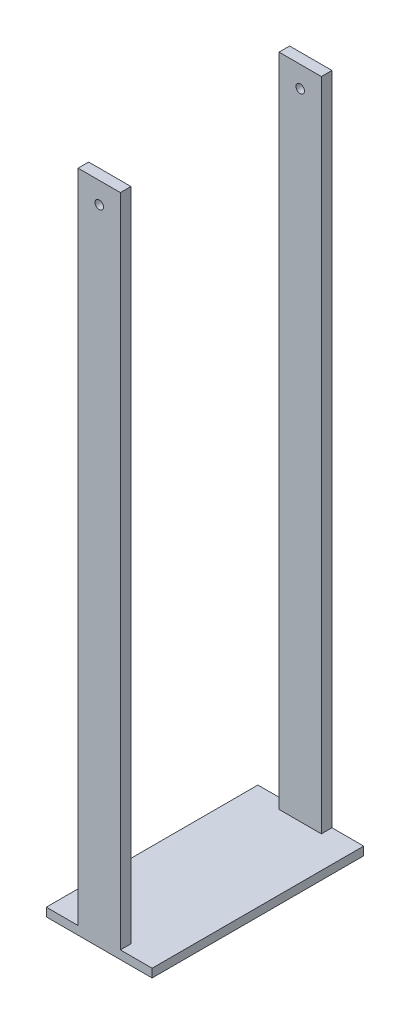
ISO-10303-21;
HEADER;
FILE_DESCRIPTION(('STEP AP214'),'2;1');
FILE_NAME('part.step','',(''),(''),'','','');
FILE_SCHEMA(('AUTOMOTIVE_DESIGN { 1 0 10303 214 1 1 1 1 }'));
ENDSEC;
DATA;
#1=APPLICATION_CONTEXT('core data for automotive mechanical design processes');
#2=APPLICATION_PROTOCOL_DEFINITION('international standard','automotive_design',2000,#1);
#3=PRODUCT_CONTEXT('',#1,'mechanical');
#4=PRODUCT('Part','Part','',(#3));
#5=PRODUCT_RELATED_PRODUCT_CATEGORY('part','',(#4));
#6=PRODUCT_DEFINITION_FORMATION('','',#4);
#7=PRODUCT_DEFINITION_CONTEXT('part definition',#1,'design');
#8=PRODUCT_DEFINITION('design','',#6,#7);
#9=PRODUCT_DEFINITION_SHAPE('','',#8);
#10=(LENGTH_UNIT() NAMED_UNIT(*) SI_UNIT(.MILLI.,.METRE.));
#11=(NAMED_UNIT(*) PLANE_ANGLE_UNIT() SI_UNIT($,.RADIAN.));
#12=(NAMED_UNIT(*) SI_UNIT($,.STERADIAN.) SOLID_ANGLE_UNIT());
#13=UNCERTAINTY_MEASURE_WITH_UNIT(LENGTH_MEASURE(1.E-05),#10,'distance_accuracy_value','');
#14=(GEOMETRIC_REPRESENTATION_CONTEXT(3) GLOBAL_UNCERTAINTY_ASSIGNED_CONTEXT((#13)) GLOBAL_UNIT_ASSIGNED_CONTEXT((#10,
#11,#12)) REPRESENTATION_CONTEXT('',''));
#15=CARTESIAN_POINT('',(0.,0.,0.));
#16=DIRECTION('',(0.,0.,1.));
#17=DIRECTION('',(1.,0.,0.));
#18=AXIS2_PLACEMENT_3D('',#15,#16,#17);
#19=CARTESIAN_POINT('',(57.3767857142857,-65.4360491071428,200.));
#20=DIRECTION('',(0.,-1.,0.));
#21=DIRECTION('',(0.,0.,-1.));
#22=AXIS2_PLACEMENT_3D('',#19,#20,#21);
#23=PLANE('',#22);
#24=DIRECTION('',(0.,0.,-1.));
#25=VECTOR('',#24,1.);
#26=CARTESIAN_POINT('',(27.3767857142857,-65.4360491071428,10.));
#27=LINE('',#26,#25);
#28=CARTESIAN_POINT('',(27.3767857142857,-65.4360491071428,10.));
#29=VERTEX_POINT('',#28);
#30=CARTESIAN_POINT('',(27.3767857142857,-65.4360491071428,0.));
#31=VERTEX_POINT('',#30);
#32=EDGE_CURVE('E48',#29,#31,#27,.T.);
#33=ORIENTED_EDGE('',*,*,#32,.F.);
#34=DIRECTION('',(1.,0.,0.));
#35=VECTOR('',#34,1.);
#36=CARTESIAN_POINT('',(27.3767857142857,-65.4360491071428,10.));
#37=LINE('',#36,#35);
#38=CARTESIAN_POINT('',(-12.6232142857143,-65.4360491071428,10.));
#39=VERTEX_POINT('',#38);
#40=EDGE_CURVE('E52',#39,#29,#37,.T.);
#41=ORIENTED_EDGE('',*,*,#40,.F.);
#42=DIRECTION('',(0.,0.,1.));
#43=VECTOR('',#42,1.);
#44=CARTESIAN_POINT('',(-12.6232142857143,-65.4360491071428,0.));
#45=LINE('',#44,#43);
#46=CARTESIAN_POINT('',(-12.6232142857143,-65.4360491071428,0.));
#47=VERTEX_POINT('',#46);
#48=EDGE_CURVE('E235',#47,#39,#45,.T.);
#49=ORIENTED_EDGE('',*,*,#48,.F.);
#50=DIRECTION('',(-1.,0.,0.));
#51=VECTOR('',#50,1.);
#52=CARTESIAN_POINT('',(57.3767857142857,-65.4360491071428,0.));
#53=LINE('',#52,#51);
#54=CARTESIAN_POINT('',(-42.6232142857143,-65.4360491071428,0.));
#55=VERTEX_POINT('',#54);
#56=EDGE_CURVE('E221',#47,#55,#53,.T.);
#57=ORIENTED_EDGE('',*,*,#56,.T.);
#58=DIRECTION('',(0.,0.,-1.));
#59=VECTOR('',#58,1.);
#60=CARTESIAN_POINT('',(-42.6232142857143,-65.4360491071428,200.));
#61=LINE('',#60,#59);
#62=CARTESIAN_POINT('',(-42.6232142857143,-65.4360491071428,200.));
#63=VERTEX_POINT('',#62);
#64=EDGE_CURVE('E211',#63,#55,#61,.T.);
#65=ORIENTED_EDGE('',*,*,#64,.F.);
#66=DIRECTION('',(-1.,0.,0.));
#67=VECTOR('',#66,1.);
#68=CARTESIAN_POINT('',(57.3767857142857,-65.4360491071428,200.));
#69=LINE('',#68,#67);
#70=CARTESIAN_POINT('',(-12.6232142857143,-65.4360491071428,200.));
#71=VERTEX_POINT('',#70);
#72=EDGE_CURVE('E202',#71,#63,#69,.T.);
#73=ORIENTED_EDGE('',*,*,#72,.F.);
#74=DIRECTION('',(0.,0.,1.));
#75=VECTOR('',#74,1.);
#76=CARTESIAN_POINT('',(-12.6232142857143,-65.4360491071428,190.));
#77=LINE('',#76,#75);
#78=CARTESIAN_POINT('',(-12.6232142857143,-65.4360491071428,190.));
#79=VERTEX_POINT('',#78);
#80=EDGE_CURVE('E157',#79,#71,#77,.T.);
#81=ORIENTED_EDGE('',*,*,#80,.F.);
#82=DIRECTION('',(-1.,0.,0.));
#83=VECTOR('',#82,1.);
#84=CARTESIAN_POINT('',(-12.6232142857143,-65.4360491071428,190.));
#85=LINE('',#84,#83);
#86=CARTESIAN_POINT('',(27.3767857142857,-65.4360491071428,190.));
#87=VERTEX_POINT('',#86);
#88=EDGE_CURVE('E147',#87,#79,#85,.T.);
#89=ORIENTED_EDGE('',*,*,#88,.F.);
#90=DIRECTION('',(0.,0.,-1.));
#91=VECTOR('',#90,1.);
#92=CARTESIAN_POINT('',(27.3767857142857,-65.4360491071428,200.));
#93=LINE('',#92,#91);
#94=CARTESIAN_POINT('',(27.3767857142857,-65.4360491071428,200.));
#95=VERTEX_POINT('',#94);
#96=EDGE_CURVE('E144',#95,#87,#93,.T.);
#97=ORIENTED_EDGE('',*,*,#96,.F.);
#98=CARTESIAN_POINT('',(57.3767857142857,-65.4360491071428,200.));
#99=VERTEX_POINT('',#98);
#100=EDGE_CURVE('E209',#99,#95,#69,.T.);
#101=ORIENTED_EDGE('',*,*,#100,.F.);
#102=DIRECTION('',(0.,0.,-1.));
#103=VECTOR('',#102,1.);
#104=CARTESIAN_POINT('',(57.3767857142857,-65.4360491071428,200.));
#105=LINE('',#104,#103);
#106=CARTESIAN_POINT('',(57.3767857142857,-65.4360491071428,0.));
#107=VERTEX_POINT('',#106);
#108=EDGE_CURVE('E215',#99,#107,#105,.T.);
#109=ORIENTED_EDGE('',*,*,#108,.T.);
#110=EDGE_CURVE('E198',#107,#31,#53,.T.);
#111=ORIENTED_EDGE('',*,*,#110,.T.);
#112=EDGE_LOOP('',(#33,#41,#49,#57,#65,#73,#81,#89,#97,#101,#109,#111));
#113=FACE_BOUND('',#112,.T.);
#114=ADVANCED_FACE('F31',(#113),#23,.F.);
#115=CARTESIAN_POINT('',(-42.6232142857143,-65.4360491071428,200.));
#116=DIRECTION('',(1.,0.,0.));
#117=DIRECTION('',(0.,1.,0.));
#118=AXIS2_PLACEMENT_3D('',#115,#116,#117);
#119=PLANE('',#118);
#120=DIRECTION('',(0.,-1.,0.));
#121=VECTOR('',#120,1.);
#122=CARTESIAN_POINT('',(-42.6232142857143,-65.4360491071428,0.));
#123=LINE('',#122,#121);
#124=CARTESIAN_POINT('',(-42.6232142857143,-73.4360491071428,0.));
#125=VERTEX_POINT('',#124);
#126=EDGE_CURVE('E192',#55,#125,#123,.T.);
#127=ORIENTED_EDGE('',*,*,#126,.T.);
#128=DIRECTION('',(0.,0.,-1.));
#129=VECTOR('',#128,1.);
#130=CARTESIAN_POINT('',(-42.6232142857143,-73.4360491071428,200.));
#131=LINE('',#130,#129);
#132=CARTESIAN_POINT('',(-42.6232142857143,-73.4360491071428,200.));
#133=VERTEX_POINT('',#132);
#134=EDGE_CURVE('E11',#133,#125,#131,.T.);
#135=ORIENTED_EDGE('',*,*,#134,.F.);
#136=DIRECTION('',(0.,-1.,0.));
#137=VECTOR('',#136,1.);
#138=CARTESIAN_POINT('',(-42.6232142857143,-65.4360491071428,200.));
#139=LINE('',#138,#137);
#140=EDGE_CURVE('E194',#63,#133,#139,.T.);
#141=ORIENTED_EDGE('',*,*,#140,.F.);
#142=ORIENTED_EDGE('',*,*,#64,.T.);
#143=EDGE_LOOP('',(#127,#135,#141,#142));
#144=FACE_BOUND('',#143,.T.);
#145=ADVANCED_FACE('F33',(#144),#119,.F.);
#146=CARTESIAN_POINT('',(-42.6232142857143,-73.4360491071428,200.));
#147=DIRECTION('',(0.,1.,0.));
#148=DIRECTION('',(0.,0.,1.));
#149=AXIS2_PLACEMENT_3D('',#146,#147,#148);
#150=PLANE('',#149);
#151=DIRECTION('',(1.,0.,0.));
#152=VECTOR('',#151,1.);
#153=CARTESIAN_POINT('',(-42.6232142857143,-73.4360491071428,0.));
#154=LINE('',#153,#152);
#155=CARTESIAN_POINT('',(57.3767857142857,-73.4360491071428,0.));
#156=VERTEX_POINT('',#155);
#157=EDGE_CURVE('E223',#125,#156,#154,.T.);
#158=ORIENTED_EDGE('',*,*,#157,.T.);
#159=DIRECTION('',(0.,0.,-1.));
#160=VECTOR('',#159,1.);
#161=CARTESIAN_POINT('',(57.3767857142857,-73.4360491071428,200.));
#162=LINE('',#161,#160);
#163=CARTESIAN_POINT('',(57.3767857142857,-73.4360491071428,200.));
#164=VERTEX_POINT('',#163);
#165=EDGE_CURVE('E40',#164,#156,#162,.T.);
#166=ORIENTED_EDGE('',*,*,#165,.F.);
#167=DIRECTION('',(1.,0.,0.));
#168=VECTOR('',#167,1.);
#169=CARTESIAN_POINT('',(-42.6232142857143,-73.4360491071428,200.));
#170=LINE('',#169,#168);
#171=EDGE_CURVE('E197',#133,#164,#170,.T.);
#172=ORIENTED_EDGE('',*,*,#171,.F.);
#173=ORIENTED_EDGE('',*,*,#134,.T.);
#174=EDGE_LOOP('',(#158,#166,#172,#173));
#175=FACE_BOUND('',#174,.T.);
#176=ADVANCED_FACE('F232',(#175),#150,.F.);
#177=CARTESIAN_POINT('',(57.3767857142857,-65.4360491071428,200.));
#178=DIRECTION('',(-1.,0.,0.));
#179=DIRECTION('',(0.,0.,1.));
#180=AXIS2_PLACEMENT_3D('',#177,#178,#179);
#181=PLANE('',#180);
#182=DIRECTION('',(0.,1.,0.));
#183=VECTOR('',#182,1.);
#184=CARTESIAN_POINT('',(57.3767857142857,-65.4360491071428,0.));
#185=LINE('',#184,#183);
#186=EDGE_CURVE('E222',#156,#107,#185,.T.);
#187=ORIENTED_EDGE('',*,*,#186,.T.);
#188=ORIENTED_EDGE('',*,*,#108,.F.);
#189=DIRECTION('',(0.,1.,0.));
#190=VECTOR('',#189,1.);
#191=CARTESIAN_POINT('',(57.3767857142857,-65.4360491071428,200.));
#192=LINE('',#191,#190);
#193=EDGE_CURVE('E200',#164,#99,#192,.T.);
#194=ORIENTED_EDGE('',*,*,#193,.F.);
#195=ORIENTED_EDGE('',*,*,#165,.T.);
#196=EDGE_LOOP('',(#187,#188,#194,#195));
#197=FACE_BOUND('',#196,.T.);
#198=ADVANCED_FACE('F269',(#197),#181,.F.);
#199=CARTESIAN_POINT('',(-42.6232142857143,-73.4360491071428,200.));
#200=DIRECTION('',(0.,0.,1.));
#201=DIRECTION('',(1.,0.,0.));
#202=AXIS2_PLACEMENT_3D('',#199,#200,#201);
#203=PLANE('',#202);
#204=CARTESIAN_POINT('',(7.37678571428573,534.563950892857,200.));
#205=DIRECTION('',(0.,0.,1.));
#206=DIRECTION('',(1.,0.,0.));
#207=AXIS2_PLACEMENT_3D('',#204,#205,#206);
#208=CIRCLE('',#207,4.);
#209=CARTESIAN_POINT('',(11.3767857142857,534.563950892857,200.));
#210=VERTEX_POINT('',#209);
#211=EDGE_CURVE('E366',#210,#210,#208,.T.);
#212=ORIENTED_EDGE('',*,*,#211,.F.);
#213=EDGE_LOOP('',(#212));
#214=FACE_BOUND('',#213,.T.);
#215=ORIENTED_EDGE('',*,*,#140,.T.);
#216=ORIENTED_EDGE('',*,*,#171,.T.);
#217=ORIENTED_EDGE('',*,*,#193,.T.);
#218=ORIENTED_EDGE('',*,*,#100,.T.);
#219=DIRECTION('',(0.,-1.,0.));
#220=VECTOR('',#219,1.);
#221=CARTESIAN_POINT('',(27.3767857142857,554.563950892857,200.));
#222=LINE('',#221,#220);
#223=CARTESIAN_POINT('',(27.3767857142857,554.563950892857,200.));
#224=VERTEX_POINT('',#223);
#225=EDGE_CURVE('E187',#224,#95,#222,.T.);
#226=ORIENTED_EDGE('',*,*,#225,.F.);
#227=DIRECTION('',(1.,0.,0.));
#228=VECTOR('',#227,1.);
#229=CARTESIAN_POINT('',(-12.6232142857143,554.563950892857,200.));
#230=LINE('',#229,#228);
#231=CARTESIAN_POINT('',(-12.6232142857143,554.563950892857,200.));
#232=VERTEX_POINT('',#231);
#233=EDGE_CURVE('E153',#232,#224,#230,.T.);
#234=ORIENTED_EDGE('',*,*,#233,.F.);
#235=DIRECTION('',(0.,-1.,0.));
#236=VECTOR('',#235,1.);
#237=CARTESIAN_POINT('',(-12.6232142857143,554.563950892857,200.));
#238=LINE('',#237,#236);
#239=EDGE_CURVE('E163',#232,#71,#238,.T.);
#240=ORIENTED_EDGE('',*,*,#239,.T.);
#241=ORIENTED_EDGE('',*,*,#72,.T.);
#242=EDGE_LOOP('',(#215,#216,#217,#218,#226,#234,#240,#241));
#243=FACE_BOUND('',#242,.T.);
#244=ADVANCED_FACE('F234',(#214,#243),#203,.T.);
#245=CARTESIAN_POINT('',(-42.6232142857143,-73.4360491071428,0.));
#246=DIRECTION('',(0.,0.,1.));
#247=DIRECTION('',(1.,0.,0.));
#248=AXIS2_PLACEMENT_3D('',#245,#246,#247);
#249=PLANE('',#248);
#250=CARTESIAN_POINT('',(7.37678571428573,534.563950892857,0.));
#251=DIRECTION('',(0.,0.,1.));
#252=DIRECTION('',(1.,0.,0.));
#253=AXIS2_PLACEMENT_3D('',#250,#251,#252);
#254=CIRCLE('',#253,4.);
#255=CARTESIAN_POINT('',(11.3767857142857,534.563950892857,0.));
#256=VERTEX_POINT('',#255);
#257=EDGE_CURVE('E245',#256,#256,#254,.T.);
#258=ORIENTED_EDGE('',*,*,#257,.T.);
#259=EDGE_LOOP('',(#258));
#260=FACE_BOUND('',#259,.T.);
#261=ORIENTED_EDGE('',*,*,#126,.F.);
#262=ORIENTED_EDGE('',*,*,#56,.F.);
#263=DIRECTION('',(0.,-1.,0.));
#264=VECTOR('',#263,1.);
#265=CARTESIAN_POINT('',(-12.6232142857143,554.563950892857,0.));
#266=LINE('',#265,#264);
#267=CARTESIAN_POINT('',(-12.6232142857143,554.563950892857,0.));
#268=VERTEX_POINT('',#267);
#269=EDGE_CURVE('E129',#268,#47,#266,.T.);
#270=ORIENTED_EDGE('',*,*,#269,.F.);
#271=DIRECTION('',(-1.,0.,0.));
#272=VECTOR('',#271,1.);
#273=CARTESIAN_POINT('',(27.3767857142857,554.563950892857,0.));
#274=LINE('',#273,#272);
#275=CARTESIAN_POINT('',(27.3767857142857,554.563950892857,0.));
#276=VERTEX_POINT('',#275);
#277=EDGE_CURVE('E121',#276,#268,#274,.T.);
#278=ORIENTED_EDGE('',*,*,#277,.F.);
#279=DIRECTION('',(0.,-1.,0.));
#280=VECTOR('',#279,1.);
#281=CARTESIAN_POINT('',(27.3767857142857,554.563950892857,0.));
#282=LINE('',#281,#280);
#283=EDGE_CURVE('E127',#276,#31,#282,.T.);
#284=ORIENTED_EDGE('',*,*,#283,.T.);
#285=ORIENTED_EDGE('',*,*,#110,.F.);
#286=ORIENTED_EDGE('',*,*,#186,.F.);
#287=ORIENTED_EDGE('',*,*,#157,.F.);
#288=EDGE_LOOP('',(#261,#262,#270,#278,#284,#285,#286,#287));
#289=FACE_BOUND('',#288,.T.);
#290=ADVANCED_FACE('F124',(#260,#289),#249,.F.);
#291=CARTESIAN_POINT('',(27.3767857142857,554.563950892857,200.));
#292=DIRECTION('',(-1.,0.,0.));
#293=DIRECTION('',(0.,0.,1.));
#294=AXIS2_PLACEMENT_3D('',#291,#292,#293);
#295=PLANE('',#294);
#296=ORIENTED_EDGE('',*,*,#96,.T.);
#297=DIRECTION('',(0.,-1.,0.));
#298=VECTOR('',#297,1.);
#299=CARTESIAN_POINT('',(27.3767857142857,554.563950892857,190.));
#300=LINE('',#299,#298);
#301=CARTESIAN_POINT('',(27.3767857142857,554.563950892857,190.));
#302=VERTEX_POINT('',#301);
#303=EDGE_CURVE('E182',#302,#87,#300,.T.);
#304=ORIENTED_EDGE('',*,*,#303,.F.);
#305=DIRECTION('',(0.,0.,-1.));
#306=VECTOR('',#305,1.);
#307=CARTESIAN_POINT('',(27.3767857142857,554.563950892857,200.));
#308=LINE('',#307,#306);
#309=EDGE_CURVE('E156',#224,#302,#308,.T.);
#310=ORIENTED_EDGE('',*,*,#309,.F.);
#311=ORIENTED_EDGE('',*,*,#225,.T.);
#312=EDGE_LOOP('',(#296,#304,#310,#311));
#313=FACE_BOUND('',#312,.T.);
#314=ADVANCED_FACE('F294',(#313),#295,.F.);
#315=CARTESIAN_POINT('',(-12.6232142857143,554.563950892857,190.));
#316=DIRECTION('',(0.,0.,1.));
#317=DIRECTION('',(1.,0.,0.));
#318=AXIS2_PLACEMENT_3D('',#315,#316,#317);
#319=PLANE('',#318);
#320=CARTESIAN_POINT('',(7.37678571428573,534.563950892857,190.));
#321=DIRECTION('',(0.,0.,1.));
#322=DIRECTION('',(1.,0.,0.));
#323=AXIS2_PLACEMENT_3D('',#320,#321,#322);
#324=CIRCLE('',#323,4.);
#325=CARTESIAN_POINT('',(11.3767857142857,534.563950892857,190.));
#326=VERTEX_POINT('',#325);
#327=EDGE_CURVE('E369',#326,#326,#324,.T.);
#328=ORIENTED_EDGE('',*,*,#327,.T.);
#329=EDGE_LOOP('',(#328));
#330=FACE_BOUND('',#329,.T.);
#331=ORIENTED_EDGE('',*,*,#88,.T.);
#332=DIRECTION('',(0.,-1.,0.));
#333=VECTOR('',#332,1.);
#334=CARTESIAN_POINT('',(-12.6232142857143,554.563950892857,190.));
#335=LINE('',#334,#333);
#336=CARTESIAN_POINT('',(-12.6232142857143,554.563950892857,190.));
#337=VERTEX_POINT('',#336);
#338=EDGE_CURVE('E168',#337,#79,#335,.T.);
#339=ORIENTED_EDGE('',*,*,#338,.F.);
#340=DIRECTION('',(-1.,0.,0.));
#341=VECTOR('',#340,1.);
#342=CARTESIAN_POINT('',(-12.6232142857143,554.563950892857,190.));
#343=LINE('',#342,#341);
#344=EDGE_CURVE('E159',#302,#337,#343,.T.);
#345=ORIENTED_EDGE('',*,*,#344,.F.);
#346=ORIENTED_EDGE('',*,*,#303,.T.);
#347=EDGE_LOOP('',(#331,#339,#345,#346));
#348=FACE_BOUND('',#347,.T.);
#349=ADVANCED_FACE('F302',(#330,#348),#319,.F.);
#350=CARTESIAN_POINT('',(-12.6232142857143,554.563950892857,190.));
#351=DIRECTION('',(1.,0.,0.));
#352=DIRECTION('',(0.,0.,-1.));
#353=AXIS2_PLACEMENT_3D('',#350,#351,#352);
#354=PLANE('',#353);
#355=ORIENTED_EDGE('',*,*,#80,.T.);
#356=ORIENTED_EDGE('',*,*,#239,.F.);
#357=DIRECTION('',(0.,0.,1.));
#358=VECTOR('',#357,1.);
#359=CARTESIAN_POINT('',(-12.6232142857143,554.563950892857,190.));
#360=LINE('',#359,#358);
#361=EDGE_CURVE('E161',#337,#232,#360,.T.);
#362=ORIENTED_EDGE('',*,*,#361,.F.);
#363=ORIENTED_EDGE('',*,*,#338,.T.);
#364=EDGE_LOOP('',(#355,#356,#362,#363));
#365=FACE_BOUND('',#364,.T.);
#366=ADVANCED_FACE('F310',(#365),#354,.F.);
#367=CARTESIAN_POINT('',(-12.6232142857143,554.563950892857,200.));
#368=DIRECTION('',(0.,-1.,0.));
#369=DIRECTION('',(0.,0.,-1.));
#370=AXIS2_PLACEMENT_3D('',#367,#368,#369);
#371=PLANE('',#370);
#372=ORIENTED_EDGE('',*,*,#233,.T.);
#373=ORIENTED_EDGE('',*,*,#309,.T.);
#374=ORIENTED_EDGE('',*,*,#344,.T.);
#375=ORIENTED_EDGE('',*,*,#361,.T.);
#376=EDGE_LOOP('',(#372,#373,#374,#375));
#377=FACE_BOUND('',#376,.T.);
#378=ADVANCED_FACE('F317',(#377),#371,.F.);
#379=CARTESIAN_POINT('',(27.3767857142857,554.563950892857,10.));
#380=DIRECTION('',(-1.,0.,0.));
#381=DIRECTION('',(0.,0.,1.));
#382=AXIS2_PLACEMENT_3D('',#379,#380,#381);
#383=PLANE('',#382);
#384=ORIENTED_EDGE('',*,*,#32,.T.);
#385=ORIENTED_EDGE('',*,*,#283,.F.);
#386=DIRECTION('',(0.,0.,-1.));
#387=VECTOR('',#386,1.);
#388=CARTESIAN_POINT('',(27.3767857142857,554.563950892857,10.));
#389=LINE('',#388,#387);
#390=CARTESIAN_POINT('',(27.3767857142857,554.563950892857,10.));
#391=VERTEX_POINT('',#390);
#392=EDGE_CURVE('E133',#391,#276,#389,.T.);
#393=ORIENTED_EDGE('',*,*,#392,.F.);
#394=DIRECTION('',(0.,-1.,0.));
#395=VECTOR('',#394,1.);
#396=CARTESIAN_POINT('',(27.3767857142857,554.563950892857,10.));
#397=LINE('',#396,#395);
#398=EDGE_CURVE('E242',#391,#29,#397,.T.);
#399=ORIENTED_EDGE('',*,*,#398,.T.);
#400=EDGE_LOOP('',(#384,#385,#393,#399));
#401=FACE_BOUND('',#400,.T.);
#402=ADVANCED_FACE('F143',(#401),#383,.F.);
#403=CARTESIAN_POINT('',(-12.6232142857143,554.563950892857,0.));
#404=DIRECTION('',(1.,0.,0.));
#405=DIRECTION('',(0.,0.,-1.));
#406=AXIS2_PLACEMENT_3D('',#403,#404,#405);
#407=PLANE('',#406);
#408=ORIENTED_EDGE('',*,*,#48,.T.);
#409=DIRECTION('',(0.,-1.,0.));
#410=VECTOR('',#409,1.);
#411=CARTESIAN_POINT('',(-12.6232142857143,554.563950892857,10.));
#412=LINE('',#411,#410);
#413=CARTESIAN_POINT('',(-12.6232142857143,554.563950892857,10.));
#414=VERTEX_POINT('',#413);
#415=EDGE_CURVE('E149',#414,#39,#412,.T.);
#416=ORIENTED_EDGE('',*,*,#415,.F.);
#417=DIRECTION('',(0.,0.,1.));
#418=VECTOR('',#417,1.);
#419=CARTESIAN_POINT('',(-12.6232142857143,554.563950892857,0.));
#420=LINE('',#419,#418);
#421=EDGE_CURVE('E132',#268,#414,#420,.T.);
#422=ORIENTED_EDGE('',*,*,#421,.F.);
#423=ORIENTED_EDGE('',*,*,#269,.T.);
#424=EDGE_LOOP('',(#408,#416,#422,#423));
#425=FACE_BOUND('',#424,.T.);
#426=ADVANCED_FACE('F240',(#425),#407,.F.);
#427=CARTESIAN_POINT('',(27.3767857142857,554.563950892857,10.));
#428=DIRECTION('',(0.,0.,-1.));
#429=DIRECTION('',(-1.,0.,0.));
#430=AXIS2_PLACEMENT_3D('',#427,#428,#429);
#431=PLANE('',#430);
#432=CARTESIAN_POINT('',(7.37678571428573,534.563950892857,10.));
#433=DIRECTION('',(0.,0.,-1.));
#434=DIRECTION('',(-1.,0.,0.));
#435=AXIS2_PLACEMENT_3D('',#432,#433,#434);
#436=CIRCLE('',#435,4.);
#437=CARTESIAN_POINT('',(3.37678571428572,534.563950892857,10.));
#438=VERTEX_POINT('',#437);
#439=EDGE_CURVE('E35',#438,#438,#436,.T.);
#440=ORIENTED_EDGE('',*,*,#439,.T.);
#441=EDGE_LOOP('',(#440));
#442=FACE_BOUND('',#441,.T.);
#443=ORIENTED_EDGE('',*,*,#40,.T.);
#444=ORIENTED_EDGE('',*,*,#398,.F.);
#445=DIRECTION('',(1.,0.,0.));
#446=VECTOR('',#445,1.);
#447=CARTESIAN_POINT('',(27.3767857142857,554.563950892857,10.));
#448=LINE('',#447,#446);
#449=EDGE_CURVE('E138',#414,#391,#448,.T.);
#450=ORIENTED_EDGE('',*,*,#449,.F.);
#451=ORIENTED_EDGE('',*,*,#415,.T.);
#452=EDGE_LOOP('',(#443,#444,#450,#451));
#453=FACE_BOUND('',#452,.T.);
#454=ADVANCED_FACE('F249',(#442,#453),#431,.F.);
#455=CARTESIAN_POINT('',(27.3767857142857,554.563950892857,0.));
#456=DIRECTION('',(0.,1.,0.));
#457=DIRECTION('',(0.,0.,1.));
#458=AXIS2_PLACEMENT_3D('',#455,#456,#457);
#459=PLANE('',#458);
#460=ORIENTED_EDGE('',*,*,#392,.T.);
#461=ORIENTED_EDGE('',*,*,#277,.T.);
#462=ORIENTED_EDGE('',*,*,#421,.T.);
#463=ORIENTED_EDGE('',*,*,#449,.T.);
#464=EDGE_LOOP('',(#460,#461,#462,#463));
#465=FACE_BOUND('',#464,.T.);
#466=ADVANCED_FACE('F136',(#465),#459,.T.);
#467=CARTESIAN_POINT('',(7.37678571428573,534.563950892857,-420.));
#468=DIRECTION('',(0.,0.,1.));
#469=DIRECTION('',(1.,0.,0.));
#470=AXIS2_PLACEMENT_3D('',#467,#468,#469);
#471=CYLINDRICAL_SURFACE('',#470,4.);
#472=ORIENTED_EDGE('',*,*,#439,.F.);
#473=EDGE_LOOP('',(#472));
#474=FACE_BOUND('',#473,.T.);
#475=ORIENTED_EDGE('',*,*,#257,.F.);
#476=EDGE_LOOP('',(#475));
#477=FACE_BOUND('',#476,.T.);
#478=ADVANCED_FACE('F257',(#474,#477),#471,.F.);
#479=ORIENTED_EDGE('',*,*,#211,.T.);
#480=EDGE_LOOP('',(#479));
#481=FACE_BOUND('',#480,.T.);
#482=ORIENTED_EDGE('',*,*,#327,.F.);
#483=EDGE_LOOP('',(#482));
#484=FACE_BOUND('',#483,.T.);
#485=ADVANCED_FACE('F350',(#481,#484),#471,.F.);
#486=CLOSED_SHELL('',(#114,#145,#176,#198,#244,#290,#314,#349,#366,#378,#402,#426,#454,#466,
#478,#485));
#487=MANIFOLD_SOLID_BREP('B2',#486);
#488=ADVANCED_BREP_SHAPE_REPRESENTATION('',(#18,#487),#14);
#489=SHAPE_DEFINITION_REPRESENTATION(#9,#488);
ENDSEC;
END-ISO-10303-21;
